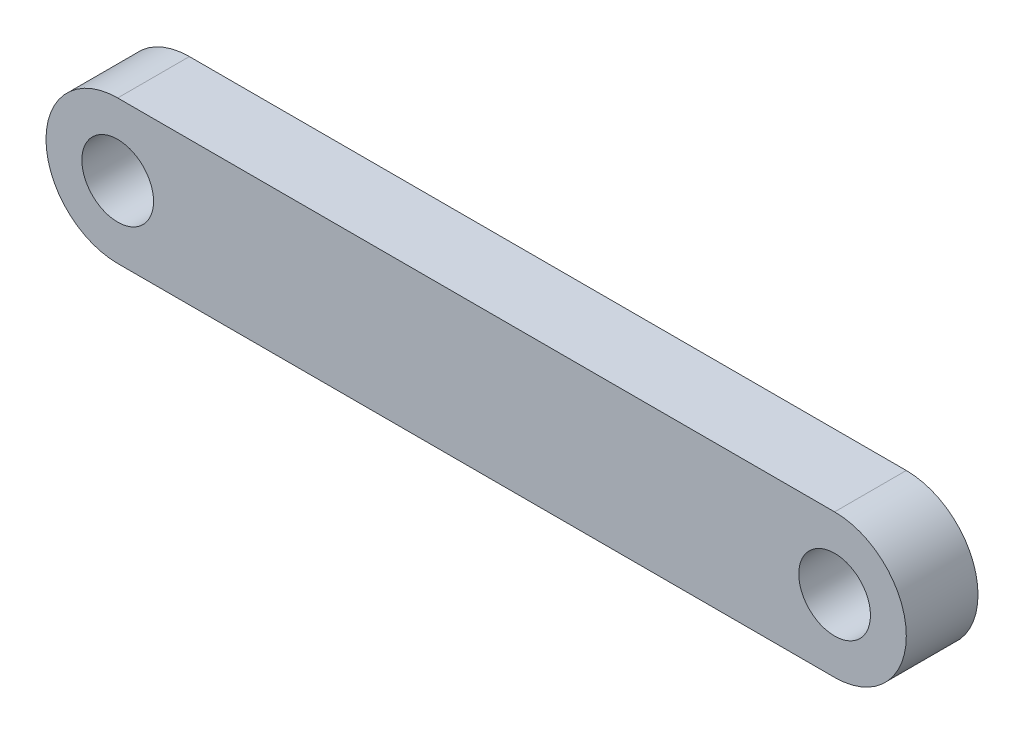
ISO-10303-21;
HEADER;
FILE_DESCRIPTION(('STEP AP214'),'2;1');
FILE_NAME('part.step','',(''),(''),'','','');
FILE_SCHEMA(('AUTOMOTIVE_DESIGN { 1 0 10303 214 1 1 1 1 }'));
ENDSEC;
DATA;
#1=APPLICATION_CONTEXT('core data for automotive mechanical design processes');
#2=APPLICATION_PROTOCOL_DEFINITION('international standard','automotive_design',2000,#1);
#3=PRODUCT_CONTEXT('',#1,'mechanical');
#4=PRODUCT('Part','Part','',(#3));
#5=PRODUCT_RELATED_PRODUCT_CATEGORY('part','',(#4));
#6=PRODUCT_DEFINITION_FORMATION('','',#4);
#7=PRODUCT_DEFINITION_CONTEXT('part definition',#1,'design');
#8=PRODUCT_DEFINITION('design','',#6,#7);
#9=PRODUCT_DEFINITION_SHAPE('','',#8);
#10=(LENGTH_UNIT() NAMED_UNIT(*) SI_UNIT(.MILLI.,.METRE.));
#11=(NAMED_UNIT(*) PLANE_ANGLE_UNIT() SI_UNIT($,.RADIAN.));
#12=(NAMED_UNIT(*) SI_UNIT($,.STERADIAN.) SOLID_ANGLE_UNIT());
#13=UNCERTAINTY_MEASURE_WITH_UNIT(LENGTH_MEASURE(1.E-05),#10,'distance_accuracy_value','');
#14=(GEOMETRIC_REPRESENTATION_CONTEXT(3) GLOBAL_UNCERTAINTY_ASSIGNED_CONTEXT((#13)) GLOBAL_UNIT_ASSIGNED_CONTEXT((#10,
#11,#12)) REPRESENTATION_CONTEXT('',''));
#15=CARTESIAN_POINT('',(0.,0.,0.));
#16=DIRECTION('',(0.,0.,1.));
#17=DIRECTION('',(1.,0.,0.));
#18=AXIS2_PLACEMENT_3D('',#15,#16,#17);
#19=CARTESIAN_POINT('',(50.,0.,10.));
#20=DIRECTION('',(0.,0.,-1.));
#21=DIRECTION('',(-1.,0.,0.));
#22=AXIS2_PLACEMENT_3D('',#19,#20,#21);
#23=CYLINDRICAL_SURFACE('',#22,10.);
#24=CARTESIAN_POINT('',(50.,0.,0.));
#25=DIRECTION('',(0.,0.,1.));
#26=DIRECTION('',(1.,0.,0.));
#27=AXIS2_PLACEMENT_3D('',#24,#25,#26);
#28=CIRCLE('',#27,10.);
#29=CARTESIAN_POINT('',(50.,-10.,0.));
#30=VERTEX_POINT('',#29);
#31=CARTESIAN_POINT('',(50.,10.,0.));
#32=VERTEX_POINT('',#31);
#33=EDGE_CURVE('E110',#30,#32,#28,.T.);
#34=ORIENTED_EDGE('',*,*,#33,.T.);
#35=DIRECTION('',(0.,0.,-1.));
#36=VECTOR('',#35,1.);
#37=CARTESIAN_POINT('',(50.,10.,10.));
#38=LINE('',#37,#36);
#39=CARTESIAN_POINT('',(50.,10.,10.));
#40=VERTEX_POINT('',#39);
#41=EDGE_CURVE('E11',#40,#32,#38,.T.);
#42=ORIENTED_EDGE('',*,*,#41,.F.);
#43=CARTESIAN_POINT('',(50.,0.,10.));
#44=DIRECTION('',(0.,0.,1.));
#45=DIRECTION('',(1.,0.,0.));
#46=AXIS2_PLACEMENT_3D('',#43,#44,#45);
#47=CIRCLE('',#46,10.);
#48=CARTESIAN_POINT('',(50.,-10.,10.));
#49=VERTEX_POINT('',#48);
#50=EDGE_CURVE('E81',#49,#40,#47,.T.);
#51=ORIENTED_EDGE('',*,*,#50,.F.);
#52=DIRECTION('',(0.,0.,-1.));
#53=VECTOR('',#52,1.);
#54=CARTESIAN_POINT('',(50.,-10.,10.));
#55=LINE('',#54,#53);
#56=EDGE_CURVE('E109',#49,#30,#55,.T.);
#57=ORIENTED_EDGE('',*,*,#56,.T.);
#58=EDGE_LOOP('',(#34,#42,#51,#57));
#59=FACE_BOUND('',#58,.T.);
#60=ADVANCED_FACE('F39',(#59),#23,.T.);
#61=CARTESIAN_POINT('',(0.,10.,10.));
#62=DIRECTION('',(0.,1.,0.));
#63=DIRECTION('',(0.,0.,1.));
#64=AXIS2_PLACEMENT_3D('',#61,#62,#63);
#65=PLANE('',#64);
#66=DIRECTION('',(1.,0.,0.));
#67=VECTOR('',#66,1.);
#68=CARTESIAN_POINT('',(0.,10.,0.));
#69=LINE('',#68,#67);
#70=CARTESIAN_POINT('',(-50.,10.,0.));
#71=VERTEX_POINT('',#70);
#72=EDGE_CURVE('E91',#71,#32,#69,.T.);
#73=ORIENTED_EDGE('',*,*,#72,.F.);
#74=DIRECTION('',(0.,0.,-1.));
#75=VECTOR('',#74,1.);
#76=CARTESIAN_POINT('',(-50.,10.,10.));
#77=LINE('',#76,#75);
#78=CARTESIAN_POINT('',(-50.,10.,10.));
#79=VERTEX_POINT('',#78);
#80=EDGE_CURVE('E47',#79,#71,#77,.T.);
#81=ORIENTED_EDGE('',*,*,#80,.F.);
#82=DIRECTION('',(1.,0.,0.));
#83=VECTOR('',#82,1.);
#84=CARTESIAN_POINT('',(0.,10.,10.));
#85=LINE('',#84,#83);
#86=EDGE_CURVE('E89',#79,#40,#85,.T.);
#87=ORIENTED_EDGE('',*,*,#86,.T.);
#88=ORIENTED_EDGE('',*,*,#41,.T.);
#89=EDGE_LOOP('',(#73,#81,#87,#88));
#90=FACE_BOUND('',#89,.T.);
#91=ADVANCED_FACE('F88',(#90),#65,.T.);
#92=CARTESIAN_POINT('',(-50.,0.,10.));
#93=DIRECTION('',(0.,0.,-1.));
#94=DIRECTION('',(-1.,0.,0.));
#95=AXIS2_PLACEMENT_3D('',#92,#93,#94);
#96=CYLINDRICAL_SURFACE('',#95,10.);
#97=CARTESIAN_POINT('',(-50.,0.,0.));
#98=DIRECTION('',(0.,0.,1.));
#99=DIRECTION('',(1.,0.,0.));
#100=AXIS2_PLACEMENT_3D('',#97,#98,#99);
#101=CIRCLE('',#100,10.);
#102=CARTESIAN_POINT('',(-50.,-10.,0.));
#103=VERTEX_POINT('',#102);
#104=EDGE_CURVE('E70',#71,#103,#101,.T.);
#105=ORIENTED_EDGE('',*,*,#104,.T.);
#106=DIRECTION('',(0.,0.,-1.));
#107=VECTOR('',#106,1.);
#108=CARTESIAN_POINT('',(-50.,-10.,10.));
#109=LINE('',#108,#107);
#110=CARTESIAN_POINT('',(-50.,-10.,10.));
#111=VERTEX_POINT('',#110);
#112=EDGE_CURVE('E92',#111,#103,#109,.T.);
#113=ORIENTED_EDGE('',*,*,#112,.F.);
#114=CARTESIAN_POINT('',(-50.,0.,10.));
#115=DIRECTION('',(0.,0.,1.));
#116=DIRECTION('',(1.,0.,0.));
#117=AXIS2_PLACEMENT_3D('',#114,#115,#116);
#118=CIRCLE('',#117,10.);
#119=EDGE_CURVE('E93',#79,#111,#118,.T.);
#120=ORIENTED_EDGE('',*,*,#119,.F.);
#121=ORIENTED_EDGE('',*,*,#80,.T.);
#122=EDGE_LOOP('',(#105,#113,#120,#121));
#123=FACE_BOUND('',#122,.T.);
#124=ADVANCED_FACE('F94',(#123),#96,.T.);
#125=CARTESIAN_POINT('',(50.,0.,10.));
#126=DIRECTION('',(0.,0.,-1.));
#127=DIRECTION('',(-1.,0.,0.));
#128=AXIS2_PLACEMENT_3D('',#125,#126,#127);
#129=CYLINDRICAL_SURFACE('',#128,5.);
#130=CARTESIAN_POINT('',(50.,0.,10.));
#131=DIRECTION('',(0.,0.,1.));
#132=DIRECTION('',(1.,0.,0.));
#133=AXIS2_PLACEMENT_3D('',#130,#131,#132);
#134=CIRCLE('',#133,5.);
#135=CARTESIAN_POINT('',(55.,0.,10.));
#136=VERTEX_POINT('',#135);
#137=EDGE_CURVE('E103',#136,#136,#134,.T.);
#138=ORIENTED_EDGE('',*,*,#137,.T.);
#139=EDGE_LOOP('',(#138));
#140=FACE_BOUND('',#139,.T.);
#141=CARTESIAN_POINT('',(50.,0.,0.));
#142=DIRECTION('',(0.,0.,1.));
#143=DIRECTION('',(1.,0.,0.));
#144=AXIS2_PLACEMENT_3D('',#141,#142,#143);
#145=CIRCLE('',#144,5.);
#146=CARTESIAN_POINT('',(55.,0.,0.));
#147=VERTEX_POINT('',#146);
#148=EDGE_CURVE('E116',#147,#147,#145,.T.);
#149=ORIENTED_EDGE('',*,*,#148,.F.);
#150=EDGE_LOOP('',(#149));
#151=FACE_BOUND('',#150,.T.);
#152=ADVANCED_FACE('F135',(#140,#151),#129,.F.);
#153=CARTESIAN_POINT('',(0.,-10.,10.));
#154=DIRECTION('',(0.,1.,0.));
#155=DIRECTION('',(0.,0.,1.));
#156=AXIS2_PLACEMENT_3D('',#153,#154,#155);
#157=PLANE('',#156);
#158=DIRECTION('',(1.,0.,0.));
#159=VECTOR('',#158,1.);
#160=CARTESIAN_POINT('',(0.,-10.,0.));
#161=LINE('',#160,#159);
#162=EDGE_CURVE('E76',#103,#30,#161,.T.);
#163=ORIENTED_EDGE('',*,*,#162,.T.);
#164=ORIENTED_EDGE('',*,*,#56,.F.);
#165=DIRECTION('',(1.,0.,0.));
#166=VECTOR('',#165,1.);
#167=CARTESIAN_POINT('',(0.,-10.,10.));
#168=LINE('',#167,#166);
#169=EDGE_CURVE('E55',#111,#49,#168,.T.);
#170=ORIENTED_EDGE('',*,*,#169,.F.);
#171=ORIENTED_EDGE('',*,*,#112,.T.);
#172=EDGE_LOOP('',(#163,#164,#170,#171));
#173=FACE_BOUND('',#172,.T.);
#174=ADVANCED_FACE('F122',(#173),#157,.F.);
#175=CARTESIAN_POINT('',(-50.,0.,10.));
#176=DIRECTION('',(0.,0.,-1.));
#177=DIRECTION('',(-1.,0.,0.));
#178=AXIS2_PLACEMENT_3D('',#175,#176,#177);
#179=CYLINDRICAL_SURFACE('',#178,5.);
#180=CARTESIAN_POINT('',(-50.,0.,10.));
#181=DIRECTION('',(0.,0.,1.));
#182=DIRECTION('',(1.,0.,0.));
#183=AXIS2_PLACEMENT_3D('',#180,#181,#182);
#184=CIRCLE('',#183,5.);
#185=CARTESIAN_POINT('',(-45.,0.,10.));
#186=VERTEX_POINT('',#185);
#187=EDGE_CURVE('E106',#186,#186,#184,.T.);
#188=ORIENTED_EDGE('',*,*,#187,.T.);
#189=EDGE_LOOP('',(#188));
#190=FACE_BOUND('',#189,.T.);
#191=CARTESIAN_POINT('',(-50.,0.,0.));
#192=DIRECTION('',(0.,0.,1.));
#193=DIRECTION('',(1.,0.,0.));
#194=AXIS2_PLACEMENT_3D('',#191,#192,#193);
#195=CIRCLE('',#194,5.);
#196=CARTESIAN_POINT('',(-45.,0.,0.));
#197=VERTEX_POINT('',#196);
#198=EDGE_CURVE('E99',#197,#197,#195,.T.);
#199=ORIENTED_EDGE('',*,*,#198,.F.);
#200=EDGE_LOOP('',(#199));
#201=FACE_BOUND('',#200,.T.);
#202=ADVANCED_FACE('F140',(#190,#201),#179,.F.);
#203=CARTESIAN_POINT('',(0.,0.,10.));
#204=DIRECTION('',(0.,0.,1.));
#205=DIRECTION('',(1.,0.,0.));
#206=AXIS2_PLACEMENT_3D('',#203,#204,#205);
#207=PLANE('',#206);
#208=ORIENTED_EDGE('',*,*,#50,.T.);
#209=ORIENTED_EDGE('',*,*,#86,.F.);
#210=ORIENTED_EDGE('',*,*,#119,.T.);
#211=ORIENTED_EDGE('',*,*,#169,.T.);
#212=EDGE_LOOP('',(#208,#209,#210,#211));
#213=FACE_BOUND('',#212,.T.);
#214=ORIENTED_EDGE('',*,*,#137,.F.);
#215=EDGE_LOOP('',(#214));
#216=FACE_BOUND('',#215,.T.);
#217=ORIENTED_EDGE('',*,*,#187,.F.);
#218=EDGE_LOOP('',(#217));
#219=FACE_BOUND('',#218,.T.);
#220=ADVANCED_FACE('F96',(#213,#216,#219),#207,.T.);
#221=CARTESIAN_POINT('',(0.,0.,0.));
#222=DIRECTION('',(0.,0.,1.));
#223=DIRECTION('',(1.,0.,0.));
#224=AXIS2_PLACEMENT_3D('',#221,#222,#223);
#225=PLANE('',#224);
#226=ORIENTED_EDGE('',*,*,#33,.F.);
#227=ORIENTED_EDGE('',*,*,#162,.F.);
#228=ORIENTED_EDGE('',*,*,#104,.F.);
#229=ORIENTED_EDGE('',*,*,#72,.T.);
#230=EDGE_LOOP('',(#226,#227,#228,#229));
#231=FACE_BOUND('',#230,.T.);
#232=ORIENTED_EDGE('',*,*,#148,.T.);
#233=EDGE_LOOP('',(#232));
#234=FACE_BOUND('',#233,.T.);
#235=ORIENTED_EDGE('',*,*,#198,.T.);
#236=EDGE_LOOP('',(#235));
#237=FACE_BOUND('',#236,.T.);
#238=ADVANCED_FACE('F125',(#231,#234,#237),#225,.F.);
#239=CLOSED_SHELL('',(#60,#91,#124,#152,#174,#202,#220,#238));
#240=MANIFOLD_SOLID_BREP('B2',#239);
#241=ADVANCED_BREP_SHAPE_REPRESENTATION('',(#18,#240),#14);
#242=SHAPE_DEFINITION_REPRESENTATION(#9,#241);
ENDSEC;
END-ISO-10303-21;
